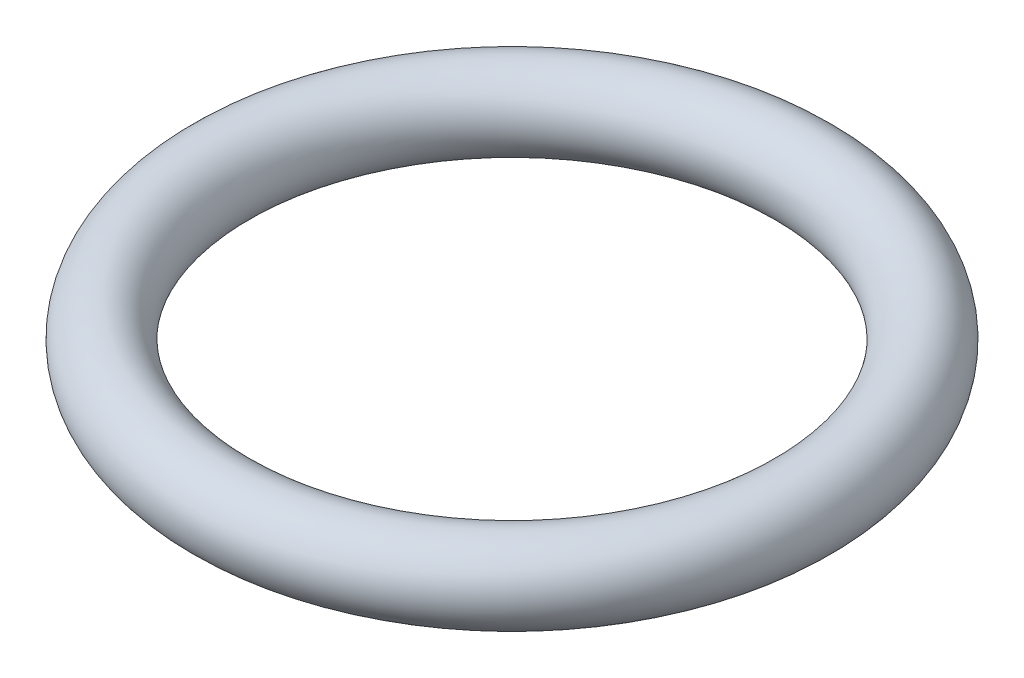
ISO-10303-21;
HEADER;
FILE_DESCRIPTION(('STEP AP214'),'2;1');
FILE_NAME('part.step','',(''),(''),'','','');
FILE_SCHEMA(('AUTOMOTIVE_DESIGN { 1 0 10303 214 1 1 1 1 }'));
ENDSEC;
DATA;
#1=APPLICATION_CONTEXT('core data for automotive mechanical design processes');
#2=APPLICATION_PROTOCOL_DEFINITION('international standard','automotive_design',2000,#1);
#3=PRODUCT_CONTEXT('',#1,'mechanical');
#4=PRODUCT('Part','Part','',(#3));
#5=PRODUCT_RELATED_PRODUCT_CATEGORY('part','',(#4));
#6=PRODUCT_DEFINITION_FORMATION('','',#4);
#7=PRODUCT_DEFINITION_CONTEXT('part definition',#1,'design');
#8=PRODUCT_DEFINITION('design','',#6,#7);
#9=PRODUCT_DEFINITION_SHAPE('','',#8);
#10=(LENGTH_UNIT() NAMED_UNIT(*) SI_UNIT(.MILLI.,.METRE.));
#11=(NAMED_UNIT(*) PLANE_ANGLE_UNIT() SI_UNIT($,.RADIAN.));
#12=(NAMED_UNIT(*) SI_UNIT($,.STERADIAN.) SOLID_ANGLE_UNIT());
#13=UNCERTAINTY_MEASURE_WITH_UNIT(LENGTH_MEASURE(1.E-05),#10,'distance_accuracy_value','');
#14=(GEOMETRIC_REPRESENTATION_CONTEXT(3) GLOBAL_UNCERTAINTY_ASSIGNED_CONTEXT((#13)) GLOBAL_UNIT_ASSIGNED_CONTEXT((#10,
#11,#12)) REPRESENTATION_CONTEXT('',''));
#15=CARTESIAN_POINT('',(0.,0.,0.));
#16=DIRECTION('',(0.,0.,1.));
#17=DIRECTION('',(1.,0.,0.));
#18=AXIS2_PLACEMENT_3D('',#15,#16,#17);
#19=CARTESIAN_POINT('',(0.,0.,0.));
#20=DIRECTION('',(0.,-1.,0.));
#21=DIRECTION('',(0.,0.,-1.));
#22=AXIS2_PLACEMENT_3D('',#19,#20,#21);
#23=TOROIDAL_SURFACE('',#22,29.36875,3.96875);
#24=CARTESIAN_POINT('',(0.,0.,-33.3375));
#25=VERTEX_POINT('',#24);
#26=VERTEX_LOOP('',#25);
#27=FACE_BOUND('',#26,.T.);
#28=ADVANCED_FACE('F31',(#27),#23,.T.);
#29=CLOSED_SHELL('',(#28));
#30=MANIFOLD_SOLID_BREP('B2',#29);
#31=ADVANCED_BREP_SHAPE_REPRESENTATION('',(#18,#30),#14);
#32=SHAPE_DEFINITION_REPRESENTATION(#9,#31);
ENDSEC;
END-ISO-10303-21;
